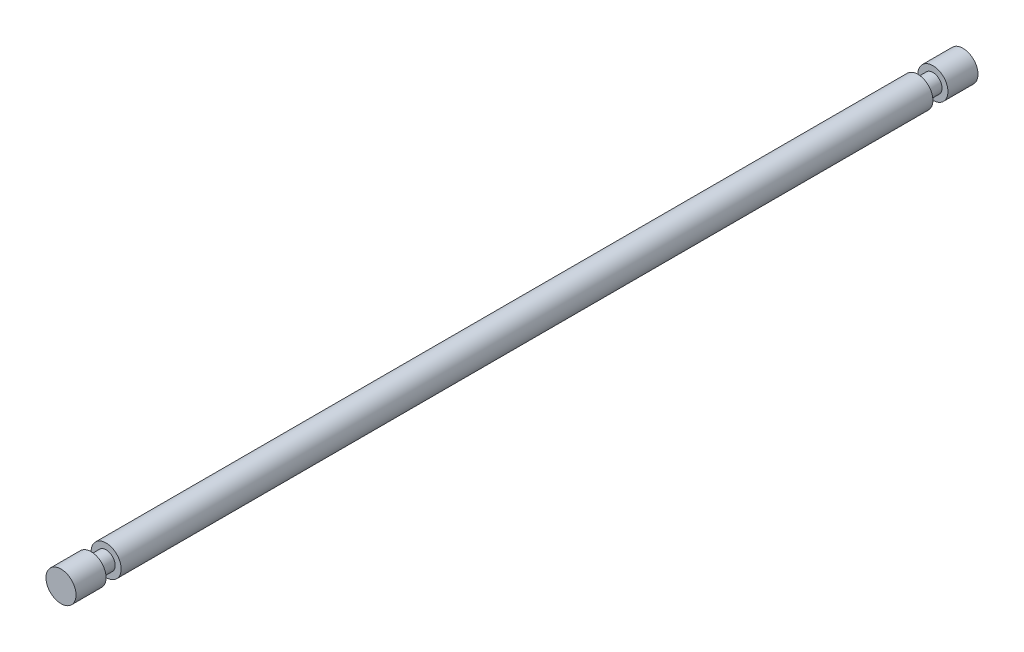
ISO-10303-21;
HEADER;
FILE_DESCRIPTION(('STEP AP214'),'2;1');
FILE_NAME('part.step','',(''),(''),'','','');
FILE_SCHEMA(('AUTOMOTIVE_DESIGN { 1 0 10303 214 1 1 1 1 }'));
ENDSEC;
DATA;
#1=APPLICATION_CONTEXT('core data for automotive mechanical design processes');
#2=APPLICATION_PROTOCOL_DEFINITION('international standard','automotive_design',2000,#1);
#3=PRODUCT_CONTEXT('',#1,'mechanical');
#4=PRODUCT('Part','Part','',(#3));
#5=PRODUCT_RELATED_PRODUCT_CATEGORY('part','',(#4));
#6=PRODUCT_DEFINITION_FORMATION('','',#4);
#7=PRODUCT_DEFINITION_CONTEXT('part definition',#1,'design');
#8=PRODUCT_DEFINITION('design','',#6,#7);
#9=PRODUCT_DEFINITION_SHAPE('','',#8);
#10=(LENGTH_UNIT() NAMED_UNIT(*) SI_UNIT(.MILLI.,.METRE.));
#11=(NAMED_UNIT(*) PLANE_ANGLE_UNIT() SI_UNIT($,.RADIAN.));
#12=(NAMED_UNIT(*) SI_UNIT($,.STERADIAN.) SOLID_ANGLE_UNIT());
#13=UNCERTAINTY_MEASURE_WITH_UNIT(LENGTH_MEASURE(1.E-05),#10,'distance_accuracy_value','');
#14=(GEOMETRIC_REPRESENTATION_CONTEXT(3) GLOBAL_UNCERTAINTY_ASSIGNED_CONTEXT((#13)) GLOBAL_UNIT_ASSIGNED_CONTEXT((#10,
#11,#12)) REPRESENTATION_CONTEXT('',''));
#15=CARTESIAN_POINT('',(0.,0.,0.));
#16=DIRECTION('',(0.,0.,1.));
#17=DIRECTION('',(1.,0.,0.));
#18=AXIS2_PLACEMENT_3D('',#15,#16,#17);
#19=CARTESIAN_POINT('',(0.,0.,0.));
#20=DIRECTION('',(0.,0.,1.));
#21=DIRECTION('',(1.,0.,0.));
#22=AXIS2_PLACEMENT_3D('',#19,#20,#21);
#23=CYLINDRICAL_SURFACE('',#22,1.27);
#24=CARTESIAN_POINT('',(0.,0.,-2.54));
#25=DIRECTION('',(0.,0.,1.));
#26=DIRECTION('',(1.,0.,0.));
#27=AXIS2_PLACEMENT_3D('',#24,#25,#26);
#28=CIRCLE('',#27,1.27);
#29=CARTESIAN_POINT('',(1.27,0.,-2.54));
#30=VERTEX_POINT('',#29);
#31=EDGE_CURVE('E41',#30,#30,#28,.T.);
#32=ORIENTED_EDGE('',*,*,#31,.T.);
#33=EDGE_LOOP('',(#32));
#34=FACE_BOUND('',#33,.T.);
#35=CARTESIAN_POINT('',(0.,0.,0.));
#36=DIRECTION('',(0.,0.,1.));
#37=DIRECTION('',(1.,0.,0.));
#38=AXIS2_PLACEMENT_3D('',#35,#36,#37);
#39=CIRCLE('',#38,1.27);
#40=CARTESIAN_POINT('',(1.27,0.,0.));
#41=VERTEX_POINT('',#40);
#42=EDGE_CURVE('E37',#41,#41,#39,.T.);
#43=ORIENTED_EDGE('',*,*,#42,.F.);
#44=EDGE_LOOP('',(#43));
#45=FACE_BOUND('',#44,.T.);
#46=ADVANCED_FACE('F30',(#34,#45),#23,.T.);
#47=CARTESIAN_POINT('',(0.,0.,0.));
#48=DIRECTION('',(0.,0.,1.));
#49=DIRECTION('',(1.,0.,0.));
#50=AXIS2_PLACEMENT_3D('',#47,#48,#49);
#51=PLANE('',#50);
#52=ORIENTED_EDGE('',*,*,#42,.T.);
#53=EDGE_LOOP('',(#52));
#54=FACE_BOUND('',#53,.T.);
#55=ADVANCED_FACE('F87',(#54),#51,.T.);
#56=CARTESIAN_POINT('',(1.27,0.,-2.54));
#57=DIRECTION('',(0.,0.,1.));
#58=DIRECTION('',(1.,0.,0.));
#59=AXIS2_PLACEMENT_3D('',#56,#57,#58);
#60=PLANE('',#59);
#61=ORIENTED_EDGE('',*,*,#31,.F.);
#62=EDGE_LOOP('',(#61));
#63=FACE_BOUND('',#62,.T.);
#64=CARTESIAN_POINT('',(0.,0.,-2.54));
#65=DIRECTION('',(0.,0.,1.));
#66=DIRECTION('',(1.,0.,0.));
#67=AXIS2_PLACEMENT_3D('',#64,#65,#66);
#68=CIRCLE('',#67,0.770587131468783);
#69=CARTESIAN_POINT('',(0.770587131468783,0.,-2.54));
#70=VERTEX_POINT('',#69);
#71=EDGE_CURVE('E45',#70,#70,#68,.T.);
#72=ORIENTED_EDGE('',*,*,#71,.T.);
#73=EDGE_LOOP('',(#72));
#74=FACE_BOUND('',#73,.T.);
#75=ADVANCED_FACE('F92',(#63,#74),#60,.F.);
#76=CARTESIAN_POINT('',(0.,0.,0.));
#77=DIRECTION('',(0.,0.,1.));
#78=DIRECTION('',(1.,0.,0.));
#79=AXIS2_PLACEMENT_3D('',#76,#77,#78);
#80=CYLINDRICAL_SURFACE('',#79,0.770587131468783);
#81=ORIENTED_EDGE('',*,*,#71,.F.);
#82=EDGE_LOOP('',(#81));
#83=FACE_BOUND('',#82,.T.);
#84=CARTESIAN_POINT('',(0.,0.,-3.81));
#85=DIRECTION('',(0.,0.,1.));
#86=DIRECTION('',(1.,0.,0.));
#87=AXIS2_PLACEMENT_3D('',#84,#85,#86);
#88=CIRCLE('',#87,0.770587131468783);
#89=CARTESIAN_POINT('',(0.770587131468783,0.,-3.81));
#90=VERTEX_POINT('',#89);
#91=EDGE_CURVE('E50',#90,#90,#88,.T.);
#92=ORIENTED_EDGE('',*,*,#91,.T.);
#93=EDGE_LOOP('',(#92));
#94=FACE_BOUND('',#93,.T.);
#95=ADVANCED_FACE('F114',(#83,#94),#80,.T.);
#96=CARTESIAN_POINT('',(0.770587131468783,0.,-3.81));
#97=DIRECTION('',(0.,0.,-1.));
#98=DIRECTION('',(-1.,0.,0.));
#99=AXIS2_PLACEMENT_3D('',#96,#97,#98);
#100=PLANE('',#99);
#101=ORIENTED_EDGE('',*,*,#91,.F.);
#102=EDGE_LOOP('',(#101));
#103=FACE_BOUND('',#102,.T.);
#104=CARTESIAN_POINT('',(0.,0.,-3.81));
#105=DIRECTION('',(0.,0.,1.));
#106=DIRECTION('',(1.,0.,0.));
#107=AXIS2_PLACEMENT_3D('',#104,#105,#106);
#108=CIRCLE('',#107,1.27);
#109=CARTESIAN_POINT('',(1.27,0.,-3.81));
#110=VERTEX_POINT('',#109);
#111=EDGE_CURVE('E53',#110,#110,#108,.T.);
#112=ORIENTED_EDGE('',*,*,#111,.T.);
#113=EDGE_LOOP('',(#112));
#114=FACE_BOUND('',#113,.T.);
#115=ADVANCED_FACE('F96',(#103,#114),#100,.F.);
#116=CARTESIAN_POINT('',(0.,0.,-72.39));
#117=DIRECTION('',(0.,0.,1.));
#118=DIRECTION('',(1.,0.,0.));
#119=AXIS2_PLACEMENT_3D('',#116,#117,#118);
#120=CIRCLE('',#119,1.27);
#121=CARTESIAN_POINT('',(1.27,0.,-72.39));
#122=VERTEX_POINT('',#121);
#123=EDGE_CURVE('E65',#122,#122,#120,.T.);
#124=ORIENTED_EDGE('',*,*,#123,.T.);
#125=EDGE_LOOP('',(#124));
#126=FACE_BOUND('',#125,.T.);
#127=ORIENTED_EDGE('',*,*,#111,.F.);
#128=EDGE_LOOP('',(#127));
#129=FACE_BOUND('',#128,.T.);
#130=ADVANCED_FACE('F69',(#126,#129),#23,.T.);
#131=CARTESIAN_POINT('',(1.27,0.,-73.66));
#132=DIRECTION('',(0.,0.,-1.));
#133=DIRECTION('',(1.,0.,0.));
#134=AXIS2_PLACEMENT_3D('',#131,#132,#133);
#135=PLANE('',#134);
#136=CARTESIAN_POINT('',(0.,0.,-73.66));
#137=DIRECTION('',(0.,0.,1.));
#138=DIRECTION('',(1.,0.,0.));
#139=AXIS2_PLACEMENT_3D('',#136,#137,#138);
#140=CIRCLE('',#139,1.27);
#141=CARTESIAN_POINT('',(1.27,0.,-73.66));
#142=VERTEX_POINT('',#141);
#143=EDGE_CURVE('E56',#142,#142,#140,.T.);
#144=ORIENTED_EDGE('',*,*,#143,.T.);
#145=EDGE_LOOP('',(#144));
#146=FACE_BOUND('',#145,.T.);
#147=CARTESIAN_POINT('',(0.,0.,-73.66));
#148=DIRECTION('',(0.,0.,1.));
#149=DIRECTION('',(1.,0.,0.));
#150=AXIS2_PLACEMENT_3D('',#147,#148,#149);
#151=CIRCLE('',#150,0.770587131468783);
#152=CARTESIAN_POINT('',(0.770587131468783,0.,-73.66));
#153=VERTEX_POINT('',#152);
#154=EDGE_CURVE('E59',#153,#153,#151,.T.);
#155=ORIENTED_EDGE('',*,*,#154,.F.);
#156=EDGE_LOOP('',(#155));
#157=FACE_BOUND('',#156,.T.);
#158=ADVANCED_FACE('F83',(#146,#157),#135,.F.);
#159=CARTESIAN_POINT('',(0.,0.,-76.2));
#160=DIRECTION('',(0.,0.,-1.));
#161=DIRECTION('',(1.,0.,0.));
#162=AXIS2_PLACEMENT_3D('',#159,#160,#161);
#163=CYLINDRICAL_SURFACE('',#162,0.770587131468783);
#164=ORIENTED_EDGE('',*,*,#154,.T.);
#165=EDGE_LOOP('',(#164));
#166=FACE_BOUND('',#165,.T.);
#167=CARTESIAN_POINT('',(0.,0.,-72.39));
#168=DIRECTION('',(0.,0.,1.));
#169=DIRECTION('',(1.,0.,0.));
#170=AXIS2_PLACEMENT_3D('',#167,#168,#169);
#171=CIRCLE('',#170,0.770587131468783);
#172=CARTESIAN_POINT('',(0.770587131468783,0.,-72.39));
#173=VERTEX_POINT('',#172);
#174=EDGE_CURVE('E62',#173,#173,#171,.T.);
#175=ORIENTED_EDGE('',*,*,#174,.F.);
#176=EDGE_LOOP('',(#175));
#177=FACE_BOUND('',#176,.T.);
#178=ADVANCED_FACE('F74',(#166,#177),#163,.T.);
#179=CARTESIAN_POINT('',(0.770587131468783,0.,-72.39));
#180=DIRECTION('',(0.,0.,1.));
#181=DIRECTION('',(-1.,0.,0.));
#182=AXIS2_PLACEMENT_3D('',#179,#180,#181);
#183=PLANE('',#182);
#184=ORIENTED_EDGE('',*,*,#174,.T.);
#185=EDGE_LOOP('',(#184));
#186=FACE_BOUND('',#185,.T.);
#187=ORIENTED_EDGE('',*,*,#123,.F.);
#188=EDGE_LOOP('',(#187));
#189=FACE_BOUND('',#188,.T.);
#190=ADVANCED_FACE('F72',(#186,#189),#183,.F.);
#191=CARTESIAN_POINT('',(0.,0.,-76.2));
#192=DIRECTION('',(0.,0.,-1.));
#193=DIRECTION('',(-1.,0.,0.));
#194=AXIS2_PLACEMENT_3D('',#191,#192,#193);
#195=PLANE('',#194);
#196=CARTESIAN_POINT('',(0.,0.,-76.2));
#197=DIRECTION('',(0.,0.,1.));
#198=DIRECTION('',(1.,0.,0.));
#199=AXIS2_PLACEMENT_3D('',#196,#197,#198);
#200=CIRCLE('',#199,1.27);
#201=CARTESIAN_POINT('',(1.27,0.,-76.2));
#202=VERTEX_POINT('',#201);
#203=EDGE_CURVE('E10',#202,#202,#200,.T.);
#204=ORIENTED_EDGE('',*,*,#203,.F.);
#205=EDGE_LOOP('',(#204));
#206=FACE_BOUND('',#205,.T.);
#207=ADVANCED_FACE('F32',(#206),#195,.T.);
#208=ORIENTED_EDGE('',*,*,#143,.F.);
#209=EDGE_LOOP('',(#208));
#210=FACE_BOUND('',#209,.T.);
#211=ORIENTED_EDGE('',*,*,#203,.T.);
#212=EDGE_LOOP('',(#211));
#213=FACE_BOUND('',#212,.T.);
#214=ADVANCED_FACE('F81',(#210,#213),#23,.T.);
#215=CLOSED_SHELL('',(#46,#55,#75,#95,#115,#130,#158,#178,#190,#207,#214));
#216=MANIFOLD_SOLID_BREP('B2',#215);
#217=ADVANCED_BREP_SHAPE_REPRESENTATION('',(#18,#216),#14);
#218=SHAPE_DEFINITION_REPRESENTATION(#9,#217);
ENDSEC;
END-ISO-10303-21;
